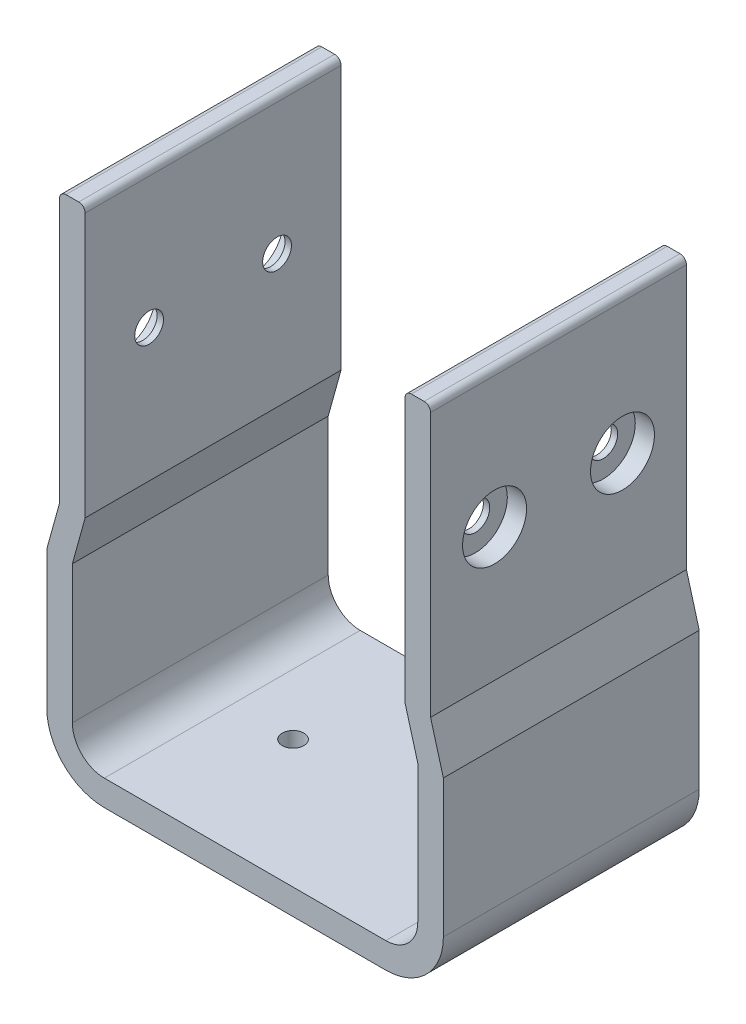
ISO-10303-21;
HEADER;
FILE_DESCRIPTION(('STEP AP214'),'2;1');
FILE_NAME('part.step','',(''),(''),'','','');
FILE_SCHEMA(('AUTOMOTIVE_DESIGN { 1 0 10303 214 1 1 1 1 }'));
ENDSEC;
DATA;
#1=APPLICATION_CONTEXT('core data for automotive mechanical design processes');
#2=APPLICATION_PROTOCOL_DEFINITION('international standard','automotive_design',2000,#1);
#3=PRODUCT_CONTEXT('',#1,'mechanical');
#4=PRODUCT('Part','Part','',(#3));
#5=PRODUCT_RELATED_PRODUCT_CATEGORY('part','',(#4));
#6=PRODUCT_DEFINITION_FORMATION('','',#4);
#7=PRODUCT_DEFINITION_CONTEXT('part definition',#1,'design');
#8=PRODUCT_DEFINITION('design','',#6,#7);
#9=PRODUCT_DEFINITION_SHAPE('','',#8);
#10=(LENGTH_UNIT() NAMED_UNIT(*) SI_UNIT(.MILLI.,.METRE.));
#11=(NAMED_UNIT(*) PLANE_ANGLE_UNIT() SI_UNIT($,.RADIAN.));
#12=(NAMED_UNIT(*) SI_UNIT($,.STERADIAN.) SOLID_ANGLE_UNIT());
#13=UNCERTAINTY_MEASURE_WITH_UNIT(LENGTH_MEASURE(1.E-05),#10,'distance_accuracy_value','');
#14=(GEOMETRIC_REPRESENTATION_CONTEXT(3) GLOBAL_UNCERTAINTY_ASSIGNED_CONTEXT((#13)) GLOBAL_UNIT_ASSIGNED_CONTEXT((#10,
#11,#12)) REPRESENTATION_CONTEXT('',''));
#15=CARTESIAN_POINT('',(0.,0.,0.));
#16=DIRECTION('',(0.,0.,1.));
#17=DIRECTION('',(1.,0.,0.));
#18=AXIS2_PLACEMENT_3D('',#15,#16,#17);
#19=CARTESIAN_POINT('',(62.,30.52,40.));
#20=DIRECTION('',(-0.963613585520307,-0.267299191545165,0.));
#21=DIRECTION('',(0.267299191545165,-0.963613585520307,0.));
#22=AXIS2_PLACEMENT_3D('',#19,#20,#21);
#23=PLANE('',#22);
#24=DIRECTION('',(-0.267299191545165,0.963613585520307,0.));
#25=VECTOR('',#24,1.);
#26=CARTESIAN_POINT('',(62.,30.52,0.));
#27=LINE('',#26,#25);
#28=CARTESIAN_POINT('',(62.,30.52,0.));
#29=VERTEX_POINT('',#28);
#30=CARTESIAN_POINT('',(60.,37.73,0.));
#31=VERTEX_POINT('',#30);
#32=EDGE_CURVE('E234',#29,#31,#27,.T.);
#33=ORIENTED_EDGE('',*,*,#32,.T.);
#34=DIRECTION('',(0.,0.,-1.));
#35=VECTOR('',#34,1.);
#36=CARTESIAN_POINT('',(60.,37.73,40.));
#37=LINE('',#36,#35);
#38=CARTESIAN_POINT('',(60.,37.73,40.));
#39=VERTEX_POINT('',#38);
#40=EDGE_CURVE('E214',#39,#31,#37,.T.);
#41=ORIENTED_EDGE('',*,*,#40,.F.);
#42=DIRECTION('',(-0.267299191545165,0.963613585520307,0.));
#43=VECTOR('',#42,1.);
#44=CARTESIAN_POINT('',(62.,30.52,40.));
#45=LINE('',#44,#43);
#46=CARTESIAN_POINT('',(62.,30.52,40.));
#47=VERTEX_POINT('',#46);
#48=EDGE_CURVE('E221',#47,#39,#45,.T.);
#49=ORIENTED_EDGE('',*,*,#48,.F.);
#50=DIRECTION('',(0.,0.,-1.));
#51=VECTOR('',#50,1.);
#52=CARTESIAN_POINT('',(62.,30.52,40.));
#53=LINE('',#52,#51);
#54=EDGE_CURVE('E407',#47,#29,#53,.T.);
#55=ORIENTED_EDGE('',*,*,#54,.T.);
#56=EDGE_LOOP('',(#33,#41,#49,#55));
#57=FACE_BOUND('',#56,.T.);
#58=ADVANCED_FACE('F43',(#57),#23,.F.);
#59=CARTESIAN_POINT('',(60.,37.73,40.));
#60=DIRECTION('',(-1.,0.,0.));
#61=DIRECTION('',(0.,-1.,0.));
#62=AXIS2_PLACEMENT_3D('',#59,#60,#61);
#63=PLANE('',#62);
#64=CARTESIAN_POINT('',(60.,58.5,30.));
#65=DIRECTION('',(1.,0.,0.));
#66=DIRECTION('',(0.,0.,-1.));
#67=AXIS2_PLACEMENT_3D('',#64,#65,#66);
#68=CIRCLE('',#67,4.99999999999999);
#69=CARTESIAN_POINT('',(60.,58.5,25.));
#70=VERTEX_POINT('',#69);
#71=EDGE_CURVE('E323',#70,#70,#68,.T.);
#72=ORIENTED_EDGE('',*,*,#71,.F.);
#73=EDGE_LOOP('',(#72));
#74=FACE_BOUND('',#73,.T.);
#75=CARTESIAN_POINT('',(60.,58.5,10.));
#76=DIRECTION('',(1.,0.,0.));
#77=DIRECTION('',(0.,0.,-1.));
#78=AXIS2_PLACEMENT_3D('',#75,#76,#77);
#79=CIRCLE('',#78,4.99999999999999);
#80=CARTESIAN_POINT('',(60.,58.5,5.00000000000001));
#81=VERTEX_POINT('',#80);
#82=EDGE_CURVE('E307',#81,#81,#79,.T.);
#83=ORIENTED_EDGE('',*,*,#82,.F.);
#84=EDGE_LOOP('',(#83));
#85=FACE_BOUND('',#84,.T.);
#86=DIRECTION('',(0.,1.,0.));
#87=VECTOR('',#86,1.);
#88=CARTESIAN_POINT('',(60.,37.73,0.));
#89=LINE('',#88,#87);
#90=CARTESIAN_POINT('',(60.,79.,0.));
#91=VERTEX_POINT('',#90);
#92=EDGE_CURVE('E410',#31,#91,#89,.T.);
#93=ORIENTED_EDGE('',*,*,#92,.T.);
#94=DIRECTION('',(0.,0.,-1.));
#95=VECTOR('',#94,1.);
#96=CARTESIAN_POINT('',(60.,79.,40.));
#97=LINE('',#96,#95);
#98=CARTESIAN_POINT('',(60.,79.,40.));
#99=VERTEX_POINT('',#98);
#100=EDGE_CURVE('E217',#91,#99,#97,.F.);
#101=ORIENTED_EDGE('',*,*,#100,.T.);
#102=DIRECTION('',(0.,1.,0.));
#103=VECTOR('',#102,1.);
#104=CARTESIAN_POINT('',(60.,37.73,40.));
#105=LINE('',#104,#103);
#106=EDGE_CURVE('E209',#39,#99,#105,.T.);
#107=ORIENTED_EDGE('',*,*,#106,.F.);
#108=ORIENTED_EDGE('',*,*,#40,.T.);
#109=EDGE_LOOP('',(#93,#101,#107,#108));
#110=FACE_BOUND('',#109,.T.);
#111=ADVANCED_FACE('F212',(#74,#85,#110),#63,.F.);
#112=CARTESIAN_POINT('',(60.,80.,40.));
#113=DIRECTION('',(0.,-1.,0.));
#114=DIRECTION('',(0.,0.,-1.));
#115=AXIS2_PLACEMENT_3D('',#112,#113,#114);
#116=PLANE('',#115);
#117=DIRECTION('',(-1.,0.,0.));
#118=VECTOR('',#117,1.);
#119=CARTESIAN_POINT('',(60.,80.,40.));
#120=LINE('',#119,#118);
#121=CARTESIAN_POINT('',(59.,80.,40.));
#122=VERTEX_POINT('',#121);
#123=CARTESIAN_POINT('',(57.,80.,40.));
#124=VERTEX_POINT('',#123);
#125=EDGE_CURVE('E220',#122,#124,#120,.T.);
#126=ORIENTED_EDGE('',*,*,#125,.F.);
#127=DIRECTION('',(0.,0.,-1.));
#128=VECTOR('',#127,1.);
#129=CARTESIAN_POINT('',(59.,80.,40.));
#130=LINE('',#129,#128);
#131=CARTESIAN_POINT('',(59.,80.,0.));
#132=VERTEX_POINT('',#131);
#133=EDGE_CURVE('E241',#122,#132,#130,.T.);
#134=ORIENTED_EDGE('',*,*,#133,.T.);
#135=DIRECTION('',(-1.,0.,0.));
#136=VECTOR('',#135,1.);
#137=CARTESIAN_POINT('',(60.,80.,0.));
#138=LINE('',#137,#136);
#139=CARTESIAN_POINT('',(57.,80.,0.));
#140=VERTEX_POINT('',#139);
#141=EDGE_CURVE('E413',#132,#140,#138,.T.);
#142=ORIENTED_EDGE('',*,*,#141,.T.);
#143=DIRECTION('',(0.,0.,-1.));
#144=VECTOR('',#143,1.);
#145=CARTESIAN_POINT('',(57.,80.,40.));
#146=LINE('',#145,#144);
#147=EDGE_CURVE('E236',#140,#124,#146,.F.);
#148=ORIENTED_EDGE('',*,*,#147,.T.);
#149=EDGE_LOOP('',(#126,#134,#142,#148));
#150=FACE_BOUND('',#149,.T.);
#151=ADVANCED_FACE('F555',(#150),#116,.F.);
#152=CARTESIAN_POINT('',(56.,80.,40.));
#153=DIRECTION('',(1.,0.,0.));
#154=DIRECTION('',(0.,0.,-1.));
#155=AXIS2_PLACEMENT_3D('',#152,#153,#154);
#156=PLANE('',#155);
#157=CARTESIAN_POINT('',(56.,58.5,30.));
#158=DIRECTION('',(1.,0.,0.));
#159=DIRECTION('',(0.,0.,-1.));
#160=AXIS2_PLACEMENT_3D('',#157,#158,#159);
#161=CIRCLE('',#160,2.25);
#162=CARTESIAN_POINT('',(56.,58.5,27.75));
#163=VERTEX_POINT('',#162);
#164=EDGE_CURVE('E304',#163,#163,#161,.T.);
#165=ORIENTED_EDGE('',*,*,#164,.T.);
#166=EDGE_LOOP('',(#165));
#167=FACE_BOUND('',#166,.T.);
#168=CARTESIAN_POINT('',(56.,58.5,10.));
#169=DIRECTION('',(1.,0.,0.));
#170=DIRECTION('',(0.,0.,-1.));
#171=AXIS2_PLACEMENT_3D('',#168,#169,#170);
#172=CIRCLE('',#171,2.25);
#173=CARTESIAN_POINT('',(56.,58.5,7.75));
#174=VERTEX_POINT('',#173);
#175=EDGE_CURVE('E299',#174,#174,#172,.T.);
#176=ORIENTED_EDGE('',*,*,#175,.T.);
#177=EDGE_LOOP('',(#176));
#178=FACE_BOUND('',#177,.T.);
#179=DIRECTION('',(0.,-1.,0.));
#180=VECTOR('',#179,1.);
#181=CARTESIAN_POINT('',(56.,80.,40.));
#182=LINE('',#181,#180);
#183=CARTESIAN_POINT('',(56.,79.,40.));
#184=VERTEX_POINT('',#183);
#185=CARTESIAN_POINT('',(56.,37.73,40.));
#186=VERTEX_POINT('',#185);
#187=EDGE_CURVE('E356',#184,#186,#182,.T.);
#188=ORIENTED_EDGE('',*,*,#187,.F.);
#189=DIRECTION('',(0.,0.,-1.));
#190=VECTOR('',#189,1.);
#191=CARTESIAN_POINT('',(56.,79.,40.));
#192=LINE('',#191,#190);
#193=CARTESIAN_POINT('',(56.,79.,0.));
#194=VERTEX_POINT('',#193);
#195=EDGE_CURVE('E276',#184,#194,#192,.T.);
#196=ORIENTED_EDGE('',*,*,#195,.T.);
#197=DIRECTION('',(0.,-1.,0.));
#198=VECTOR('',#197,1.);
#199=CARTESIAN_POINT('',(56.,80.,0.));
#200=LINE('',#199,#198);
#201=CARTESIAN_POINT('',(56.,37.73,0.));
#202=VERTEX_POINT('',#201);
#203=EDGE_CURVE('E417',#194,#202,#200,.T.);
#204=ORIENTED_EDGE('',*,*,#203,.T.);
#205=DIRECTION('',(0.,0.,-1.));
#206=VECTOR('',#205,1.);
#207=CARTESIAN_POINT('',(56.,37.73,40.));
#208=LINE('',#207,#206);
#209=EDGE_CURVE('E237',#186,#202,#208,.T.);
#210=ORIENTED_EDGE('',*,*,#209,.F.);
#211=EDGE_LOOP('',(#188,#196,#204,#210));
#212=FACE_BOUND('',#211,.T.);
#213=ADVANCED_FACE('F549',(#167,#178,#212),#156,.F.);
#214=CARTESIAN_POINT('',(56.,37.73,40.));
#215=DIRECTION('',(0.963613585520307,0.267299191545164,0.));
#216=DIRECTION('',(-0.267299191545164,0.963613585520307,0.));
#217=AXIS2_PLACEMENT_3D('',#214,#215,#216);
#218=PLANE('',#217);
#219=DIRECTION('',(0.267299191545164,-0.963613585520307,0.));
#220=VECTOR('',#219,1.);
#221=CARTESIAN_POINT('',(56.,37.73,0.));
#222=LINE('',#221,#220);
#223=CARTESIAN_POINT('',(58.,30.52,0.));
#224=VERTEX_POINT('',#223);
#225=EDGE_CURVE('E420',#202,#224,#222,.T.);
#226=ORIENTED_EDGE('',*,*,#225,.T.);
#227=DIRECTION('',(0.,0.,-1.));
#228=VECTOR('',#227,1.);
#229=CARTESIAN_POINT('',(58.,30.52,40.));
#230=LINE('',#229,#228);
#231=CARTESIAN_POINT('',(58.,30.52,40.));
#232=VERTEX_POINT('',#231);
#233=EDGE_CURVE('E244',#232,#224,#230,.T.);
#234=ORIENTED_EDGE('',*,*,#233,.F.);
#235=DIRECTION('',(0.267299191545164,-0.963613585520307,0.));
#236=VECTOR('',#235,1.);
#237=CARTESIAN_POINT('',(56.,37.73,40.));
#238=LINE('',#237,#236);
#239=EDGE_CURVE('E359',#186,#232,#238,.T.);
#240=ORIENTED_EDGE('',*,*,#239,.F.);
#241=ORIENTED_EDGE('',*,*,#209,.T.);
#242=EDGE_LOOP('',(#226,#234,#240,#241));
#243=FACE_BOUND('',#242,.T.);
#244=ADVANCED_FACE('F547',(#243),#218,.F.);
#245=CARTESIAN_POINT('',(58.,30.52,40.));
#246=DIRECTION('',(1.,0.,0.));
#247=DIRECTION('',(0.,1.,0.));
#248=AXIS2_PLACEMENT_3D('',#245,#246,#247);
#249=PLANE('',#248);
#250=DIRECTION('',(0.,-1.,0.));
#251=VECTOR('',#250,1.);
#252=CARTESIAN_POINT('',(58.,30.52,0.));
#253=LINE('',#252,#251);
#254=CARTESIAN_POINT('',(58.,9.,0.));
#255=VERTEX_POINT('',#254);
#256=EDGE_CURVE('E423',#224,#255,#253,.T.);
#257=ORIENTED_EDGE('',*,*,#256,.T.);
#258=DIRECTION('',(0.,0.,-1.));
#259=VECTOR('',#258,1.);
#260=CARTESIAN_POINT('',(58.,9.,40.));
#261=LINE('',#260,#259);
#262=CARTESIAN_POINT('',(58.,9.,40.));
#263=VERTEX_POINT('',#262);
#264=EDGE_CURVE('E514',#263,#255,#261,.T.);
#265=ORIENTED_EDGE('',*,*,#264,.F.);
#266=DIRECTION('',(0.,-1.,0.));
#267=VECTOR('',#266,1.);
#268=CARTESIAN_POINT('',(58.,30.52,40.));
#269=LINE('',#268,#267);
#270=EDGE_CURVE('E362',#232,#263,#269,.T.);
#271=ORIENTED_EDGE('',*,*,#270,.F.);
#272=ORIENTED_EDGE('',*,*,#233,.T.);
#273=EDGE_LOOP('',(#257,#265,#271,#272));
#274=FACE_BOUND('',#273,.T.);
#275=ADVANCED_FACE('F523',(#274),#249,.F.);
#276=CARTESIAN_POINT('',(53.,9.,40.));
#277=DIRECTION('',(0.,0.,-1.));
#278=DIRECTION('',(-1.,0.,0.));
#279=AXIS2_PLACEMENT_3D('',#276,#277,#278);
#280=CYLINDRICAL_SURFACE('',#279,5.);
#281=CARTESIAN_POINT('',(53.,9.,0.));
#282=DIRECTION('',(0.,0.,-1.));
#283=DIRECTION('',(1.,0.,0.));
#284=AXIS2_PLACEMENT_3D('',#281,#282,#283);
#285=CIRCLE('',#284,5.);
#286=CARTESIAN_POINT('',(53.,4.,0.));
#287=VERTEX_POINT('',#286);
#288=EDGE_CURVE('E426',#255,#287,#285,.T.);
#289=ORIENTED_EDGE('',*,*,#288,.T.);
#290=DIRECTION('',(0.,0.,-1.));
#291=VECTOR('',#290,1.);
#292=CARTESIAN_POINT('',(53.,4.,40.));
#293=LINE('',#292,#291);
#294=CARTESIAN_POINT('',(53.,4.,40.));
#295=VERTEX_POINT('',#294);
#296=EDGE_CURVE('E510',#295,#287,#293,.T.);
#297=ORIENTED_EDGE('',*,*,#296,.F.);
#298=CARTESIAN_POINT('',(53.,9.,40.));
#299=DIRECTION('',(0.,0.,-1.));
#300=DIRECTION('',(1.,0.,0.));
#301=AXIS2_PLACEMENT_3D('',#298,#299,#300);
#302=CIRCLE('',#301,5.);
#303=EDGE_CURVE('E365',#263,#295,#302,.T.);
#304=ORIENTED_EDGE('',*,*,#303,.F.);
#305=ORIENTED_EDGE('',*,*,#264,.T.);
#306=EDGE_LOOP('',(#289,#297,#304,#305));
#307=FACE_BOUND('',#306,.T.);
#308=ADVANCED_FACE('F537',(#307),#280,.F.);
#309=CARTESIAN_POINT('',(53.,4.,40.));
#310=DIRECTION('',(0.,-1.,0.));
#311=DIRECTION('',(1.,0.,0.));
#312=AXIS2_PLACEMENT_3D('',#309,#310,#311);
#313=PLANE('',#312);
#314=CARTESIAN_POINT('',(18.5,4.,20.));
#315=DIRECTION('',(0.,1.,0.));
#316=DIRECTION('',(0.,0.,1.));
#317=AXIS2_PLACEMENT_3D('',#314,#315,#316);
#318=CIRCLE('',#317,1.69999999999999);
#319=CARTESIAN_POINT('',(18.5,4.,21.7));
#320=VERTEX_POINT('',#319);
#321=EDGE_CURVE('E1051',#320,#320,#318,.T.);
#322=ORIENTED_EDGE('',*,*,#321,.F.);
#323=EDGE_LOOP('',(#322));
#324=FACE_BOUND('',#323,.T.);
#325=CARTESIAN_POINT('',(43.5,4.,20.));
#326=DIRECTION('',(0.,1.,0.));
#327=DIRECTION('',(0.,0.,1.));
#328=AXIS2_PLACEMENT_3D('',#325,#326,#327);
#329=CIRCLE('',#328,1.69999999999999);
#330=CARTESIAN_POINT('',(43.5,4.,21.7));
#331=VERTEX_POINT('',#330);
#332=EDGE_CURVE('E1055',#331,#331,#329,.T.);
#333=ORIENTED_EDGE('',*,*,#332,.F.);
#334=EDGE_LOOP('',(#333));
#335=FACE_BOUND('',#334,.T.);
#336=DIRECTION('',(-1.,0.,0.));
#337=VECTOR('',#336,1.);
#338=CARTESIAN_POINT('',(53.,4.,0.));
#339=LINE('',#338,#337);
#340=CARTESIAN_POINT('',(9.00000000000004,3.99999999999999,0.));
#341=VERTEX_POINT('',#340);
#342=EDGE_CURVE('E429',#287,#341,#339,.T.);
#343=ORIENTED_EDGE('',*,*,#342,.T.);
#344=DIRECTION('',(0.,0.,-1.));
#345=VECTOR('',#344,1.);
#346=CARTESIAN_POINT('',(9.00000000000004,3.99999999999999,40.));
#347=LINE('',#346,#345);
#348=CARTESIAN_POINT('',(9.00000000000004,3.99999999999999,40.));
#349=VERTEX_POINT('',#348);
#350=EDGE_CURVE('E506',#349,#341,#347,.T.);
#351=ORIENTED_EDGE('',*,*,#350,.F.);
#352=DIRECTION('',(-1.,0.,0.));
#353=VECTOR('',#352,1.);
#354=CARTESIAN_POINT('',(53.,4.,40.));
#355=LINE('',#354,#353);
#356=EDGE_CURVE('E368',#295,#349,#355,.T.);
#357=ORIENTED_EDGE('',*,*,#356,.F.);
#358=ORIENTED_EDGE('',*,*,#296,.T.);
#359=EDGE_LOOP('',(#343,#351,#357,#358));
#360=FACE_BOUND('',#359,.T.);
#361=ADVANCED_FACE('F541',(#324,#335,#360),#313,.F.);
#362=CARTESIAN_POINT('',(9.,8.99999999999999,40.));
#363=DIRECTION('',(0.,0.,-1.));
#364=DIRECTION('',(-1.,0.,0.));
#365=AXIS2_PLACEMENT_3D('',#362,#363,#364);
#366=CYLINDRICAL_SURFACE('',#365,5.);
#367=CARTESIAN_POINT('',(9.,8.99999999999999,0.));
#368=DIRECTION('',(0.,0.,-1.));
#369=DIRECTION('',(-1.,0.,0.));
#370=AXIS2_PLACEMENT_3D('',#367,#368,#369);
#371=CIRCLE('',#370,5.);
#372=CARTESIAN_POINT('',(4.,9.00000000000003,0.));
#373=VERTEX_POINT('',#372);
#374=EDGE_CURVE('E432',#341,#373,#371,.T.);
#375=ORIENTED_EDGE('',*,*,#374,.T.);
#376=DIRECTION('',(0.,0.,-1.));
#377=VECTOR('',#376,1.);
#378=CARTESIAN_POINT('',(4.,9.00000000000003,40.));
#379=LINE('',#378,#377);
#380=CARTESIAN_POINT('',(4.,9.00000000000003,40.));
#381=VERTEX_POINT('',#380);
#382=EDGE_CURVE('E502',#381,#373,#379,.T.);
#383=ORIENTED_EDGE('',*,*,#382,.F.);
#384=CARTESIAN_POINT('',(9.,8.99999999999999,40.));
#385=DIRECTION('',(0.,0.,-1.));
#386=DIRECTION('',(-1.,0.,0.));
#387=AXIS2_PLACEMENT_3D('',#384,#385,#386);
#388=CIRCLE('',#387,5.);
#389=EDGE_CURVE('E371',#349,#381,#388,.T.);
#390=ORIENTED_EDGE('',*,*,#389,.F.);
#391=ORIENTED_EDGE('',*,*,#350,.T.);
#392=EDGE_LOOP('',(#375,#383,#390,#391));
#393=FACE_BOUND('',#392,.T.);
#394=ADVANCED_FACE('F822',(#393),#366,.F.);
#395=CARTESIAN_POINT('',(4.,9.00000000000003,40.));
#396=DIRECTION('',(-1.,0.,0.));
#397=DIRECTION('',(0.,-1.,0.));
#398=AXIS2_PLACEMENT_3D('',#395,#396,#397);
#399=PLANE('',#398);
#400=DIRECTION('',(0.,1.,0.));
#401=VECTOR('',#400,1.);
#402=CARTESIAN_POINT('',(4.,9.00000000000003,0.));
#403=LINE('',#402,#401);
#404=CARTESIAN_POINT('',(4.,30.52,0.));
#405=VERTEX_POINT('',#404);
#406=EDGE_CURVE('E435',#373,#405,#403,.T.);
#407=ORIENTED_EDGE('',*,*,#406,.T.);
#408=DIRECTION('',(0.,0.,-1.));
#409=VECTOR('',#408,1.);
#410=CARTESIAN_POINT('',(4.,30.52,40.));
#411=LINE('',#410,#409);
#412=CARTESIAN_POINT('',(4.,30.52,40.));
#413=VERTEX_POINT('',#412);
#414=EDGE_CURVE('E498',#413,#405,#411,.T.);
#415=ORIENTED_EDGE('',*,*,#414,.F.);
#416=DIRECTION('',(0.,1.,0.));
#417=VECTOR('',#416,1.);
#418=CARTESIAN_POINT('',(4.,9.00000000000003,40.));
#419=LINE('',#418,#417);
#420=EDGE_CURVE('E374',#381,#413,#419,.T.);
#421=ORIENTED_EDGE('',*,*,#420,.F.);
#422=ORIENTED_EDGE('',*,*,#382,.T.);
#423=EDGE_LOOP('',(#407,#415,#421,#422));
#424=FACE_BOUND('',#423,.T.);
#425=ADVANCED_FACE('F951',(#424),#399,.F.);
#426=CARTESIAN_POINT('',(4.,30.52,40.));
#427=DIRECTION('',(-0.963613585520308,0.267299191545161,0.));
#428=DIRECTION('',(-0.267299191545161,-0.963613585520308,0.));
#429=AXIS2_PLACEMENT_3D('',#426,#427,#428);
#430=PLANE('',#429);
#431=DIRECTION('',(0.267299191545161,0.963613585520308,0.));
#432=VECTOR('',#431,1.);
#433=CARTESIAN_POINT('',(4.,30.52,0.));
#434=LINE('',#433,#432);
#435=CARTESIAN_POINT('',(5.99999999999999,37.73,0.));
#436=VERTEX_POINT('',#435);
#437=EDGE_CURVE('E438',#405,#436,#434,.T.);
#438=ORIENTED_EDGE('',*,*,#437,.T.);
#439=DIRECTION('',(0.,0.,-1.));
#440=VECTOR('',#439,1.);
#441=CARTESIAN_POINT('',(5.99999999999999,37.73,40.));
#442=LINE('',#441,#440);
#443=CARTESIAN_POINT('',(5.99999999999999,37.73,40.));
#444=VERTEX_POINT('',#443);
#445=EDGE_CURVE('E494',#444,#436,#442,.T.);
#446=ORIENTED_EDGE('',*,*,#445,.F.);
#447=DIRECTION('',(0.267299191545161,0.963613585520308,0.));
#448=VECTOR('',#447,1.);
#449=CARTESIAN_POINT('',(4.,30.52,40.));
#450=LINE('',#449,#448);
#451=EDGE_CURVE('E377',#413,#444,#450,.T.);
#452=ORIENTED_EDGE('',*,*,#451,.F.);
#453=ORIENTED_EDGE('',*,*,#414,.T.);
#454=EDGE_LOOP('',(#438,#446,#452,#453));
#455=FACE_BOUND('',#454,.T.);
#456=ADVANCED_FACE('F646',(#455),#430,.F.);
#457=CARTESIAN_POINT('',(5.99999999999999,37.73,40.));
#458=DIRECTION('',(-1.,0.,0.));
#459=DIRECTION('',(0.,0.,1.));
#460=AXIS2_PLACEMENT_3D('',#457,#458,#459);
#461=PLANE('',#460);
#462=CARTESIAN_POINT('',(5.99999999999999,58.5,10.));
#463=DIRECTION('',(-1.,0.,0.));
#464=DIRECTION('',(0.,0.,1.));
#465=AXIS2_PLACEMENT_3D('',#462,#463,#464);
#466=CIRCLE('',#465,2.25);
#467=CARTESIAN_POINT('',(5.99999999999999,58.5,12.25));
#468=VERTEX_POINT('',#467);
#469=EDGE_CURVE('E293',#468,#468,#466,.T.);
#470=ORIENTED_EDGE('',*,*,#469,.T.);
#471=EDGE_LOOP('',(#470));
#472=FACE_BOUND('',#471,.T.);
#473=CARTESIAN_POINT('',(5.99999999999999,58.5,30.));
#474=DIRECTION('',(-1.,0.,0.));
#475=DIRECTION('',(0.,0.,1.));
#476=AXIS2_PLACEMENT_3D('',#473,#474,#475);
#477=CIRCLE('',#476,2.25);
#478=CARTESIAN_POINT('',(5.99999999999999,58.5,32.25));
#479=VERTEX_POINT('',#478);
#480=EDGE_CURVE('E288',#479,#479,#477,.T.);
#481=ORIENTED_EDGE('',*,*,#480,.T.);
#482=EDGE_LOOP('',(#481));
#483=FACE_BOUND('',#482,.T.);
#484=DIRECTION('',(0.,1.,0.));
#485=VECTOR('',#484,1.);
#486=CARTESIAN_POINT('',(5.99999999999999,37.73,0.));
#487=LINE('',#486,#485);
#488=CARTESIAN_POINT('',(5.99999999999999,79.,0.));
#489=VERTEX_POINT('',#488);
#490=EDGE_CURVE('E441',#436,#489,#487,.T.);
#491=ORIENTED_EDGE('',*,*,#490,.T.);
#492=DIRECTION('',(0.,0.,-1.));
#493=VECTOR('',#492,1.);
#494=CARTESIAN_POINT('',(5.99999999999999,79.,40.));
#495=LINE('',#494,#493);
#496=CARTESIAN_POINT('',(5.99999999999999,79.,40.));
#497=VERTEX_POINT('',#496);
#498=EDGE_CURVE('E53',#489,#497,#495,.F.);
#499=ORIENTED_EDGE('',*,*,#498,.T.);
#500=DIRECTION('',(0.,1.,0.));
#501=VECTOR('',#500,1.);
#502=CARTESIAN_POINT('',(5.99999999999999,37.73,40.));
#503=LINE('',#502,#501);
#504=EDGE_CURVE('E380',#444,#497,#503,.T.);
#505=ORIENTED_EDGE('',*,*,#504,.F.);
#506=ORIENTED_EDGE('',*,*,#445,.T.);
#507=EDGE_LOOP('',(#491,#499,#505,#506));
#508=FACE_BOUND('',#507,.T.);
#509=ADVANCED_FACE('F640',(#472,#483,#508),#461,.F.);
#510=CARTESIAN_POINT('',(5.99999999999999,80.,40.));
#511=DIRECTION('',(0.,-1.,0.));
#512=DIRECTION('',(0.,0.,-1.));
#513=AXIS2_PLACEMENT_3D('',#510,#511,#512);
#514=PLANE('',#513);
#515=DIRECTION('',(-1.,0.,0.));
#516=VECTOR('',#515,1.);
#517=CARTESIAN_POINT('',(5.99999999999999,80.,40.));
#518=LINE('',#517,#516);
#519=CARTESIAN_POINT('',(4.99999999999999,80.,40.));
#520=VERTEX_POINT('',#519);
#521=CARTESIAN_POINT('',(2.99999999999999,80.,40.));
#522=VERTEX_POINT('',#521);
#523=EDGE_CURVE('E384',#520,#522,#518,.T.);
#524=ORIENTED_EDGE('',*,*,#523,.F.);
#525=DIRECTION('',(0.,0.,-1.));
#526=VECTOR('',#525,1.);
#527=CARTESIAN_POINT('',(4.99999999999999,80.,40.));
#528=LINE('',#527,#526);
#529=CARTESIAN_POINT('',(4.99999999999999,80.,0.));
#530=VERTEX_POINT('',#529);
#531=EDGE_CURVE('E282',#520,#530,#528,.T.);
#532=ORIENTED_EDGE('',*,*,#531,.T.);
#533=DIRECTION('',(-1.,0.,0.));
#534=VECTOR('',#533,1.);
#535=CARTESIAN_POINT('',(5.99999999999999,80.,0.));
#536=LINE('',#535,#534);
#537=CARTESIAN_POINT('',(2.99999999999999,80.,0.));
#538=VERTEX_POINT('',#537);
#539=EDGE_CURVE('E445',#530,#538,#536,.T.);
#540=ORIENTED_EDGE('',*,*,#539,.T.);
#541=DIRECTION('',(0.,0.,-1.));
#542=VECTOR('',#541,1.);
#543=CARTESIAN_POINT('',(2.99999999999999,80.,40.));
#544=LINE('',#543,#542);
#545=EDGE_CURVE('E69',#538,#522,#544,.F.);
#546=ORIENTED_EDGE('',*,*,#545,.T.);
#547=EDGE_LOOP('',(#524,#532,#540,#546));
#548=FACE_BOUND('',#547,.T.);
#549=ADVANCED_FACE('F645',(#548),#514,.F.);
#550=CARTESIAN_POINT('',(1.99999999999999,80.,40.));
#551=DIRECTION('',(1.,0.,0.));
#552=DIRECTION('',(0.,1.,0.));
#553=AXIS2_PLACEMENT_3D('',#550,#551,#552);
#554=PLANE('',#553);
#555=CARTESIAN_POINT('',(2.,58.5,10.));
#556=DIRECTION('',(-1.,0.,0.));
#557=DIRECTION('',(0.,0.,1.));
#558=AXIS2_PLACEMENT_3D('',#555,#556,#557);
#559=CIRCLE('',#558,5.);
#560=CARTESIAN_POINT('',(2.,58.5,15.));
#561=VERTEX_POINT('',#560);
#562=EDGE_CURVE('E302',#561,#561,#559,.T.);
#563=ORIENTED_EDGE('',*,*,#562,.F.);
#564=EDGE_LOOP('',(#563));
#565=FACE_BOUND('',#564,.T.);
#566=CARTESIAN_POINT('',(2.,58.5,30.));
#567=DIRECTION('',(-1.,0.,0.));
#568=DIRECTION('',(0.,0.,1.));
#569=AXIS2_PLACEMENT_3D('',#566,#567,#568);
#570=CIRCLE('',#569,5.);
#571=CARTESIAN_POINT('',(2.,58.5,35.));
#572=VERTEX_POINT('',#571);
#573=EDGE_CURVE('E297',#572,#572,#570,.T.);
#574=ORIENTED_EDGE('',*,*,#573,.F.);
#575=EDGE_LOOP('',(#574));
#576=FACE_BOUND('',#575,.T.);
#577=DIRECTION('',(0.,-1.,0.));
#578=VECTOR('',#577,1.);
#579=CARTESIAN_POINT('',(1.99999999999999,80.,40.));
#580=LINE('',#579,#578);
#581=CARTESIAN_POINT('',(1.99999999999999,79.,40.));
#582=VERTEX_POINT('',#581);
#583=CARTESIAN_POINT('',(2.,37.73,40.));
#584=VERTEX_POINT('',#583);
#585=EDGE_CURVE('E387',#582,#584,#580,.T.);
#586=ORIENTED_EDGE('',*,*,#585,.F.);
#587=DIRECTION('',(0.,0.,-1.));
#588=VECTOR('',#587,1.);
#589=CARTESIAN_POINT('',(1.99999999999999,79.,40.));
#590=LINE('',#589,#588);
#591=CARTESIAN_POINT('',(1.99999999999999,79.,0.));
#592=VERTEX_POINT('',#591);
#593=EDGE_CURVE('E11',#582,#592,#590,.T.);
#594=ORIENTED_EDGE('',*,*,#593,.T.);
#595=DIRECTION('',(0.,-1.,0.));
#596=VECTOR('',#595,1.);
#597=CARTESIAN_POINT('',(1.99999999999999,80.,0.));
#598=LINE('',#597,#596);
#599=CARTESIAN_POINT('',(2.,37.73,0.));
#600=VERTEX_POINT('',#599);
#601=EDGE_CURVE('E448',#592,#600,#598,.T.);
#602=ORIENTED_EDGE('',*,*,#601,.T.);
#603=DIRECTION('',(0.,0.,-1.));
#604=VECTOR('',#603,1.);
#605=CARTESIAN_POINT('',(2.,37.73,40.));
#606=LINE('',#605,#604);
#607=EDGE_CURVE('E490',#584,#600,#606,.T.);
#608=ORIENTED_EDGE('',*,*,#607,.F.);
#609=EDGE_LOOP('',(#586,#594,#602,#608));
#610=FACE_BOUND('',#609,.T.);
#611=ADVANCED_FACE('F593',(#565,#576,#610),#554,.F.);
#612=CARTESIAN_POINT('',(2.,37.73,40.));
#613=DIRECTION('',(0.963613585520308,-0.267299191545161,0.));
#614=DIRECTION('',(0.267299191545161,0.963613585520308,0.));
#615=AXIS2_PLACEMENT_3D('',#612,#613,#614);
#616=PLANE('',#615);
#617=DIRECTION('',(-0.267299191545161,-0.963613585520308,0.));
#618=VECTOR('',#617,1.);
#619=CARTESIAN_POINT('',(2.,37.73,0.));
#620=LINE('',#619,#618);
#621=CARTESIAN_POINT('',(0.,30.52,0.));
#622=VERTEX_POINT('',#621);
#623=EDGE_CURVE('E451',#600,#622,#620,.T.);
#624=ORIENTED_EDGE('',*,*,#623,.T.);
#625=DIRECTION('',(0.,0.,-1.));
#626=VECTOR('',#625,1.);
#627=CARTESIAN_POINT('',(0.,30.52,40.));
#628=LINE('',#627,#626);
#629=CARTESIAN_POINT('',(0.,30.52,40.));
#630=VERTEX_POINT('',#629);
#631=EDGE_CURVE('E486',#630,#622,#628,.T.);
#632=ORIENTED_EDGE('',*,*,#631,.F.);
#633=DIRECTION('',(-0.267299191545161,-0.963613585520308,0.));
#634=VECTOR('',#633,1.);
#635=CARTESIAN_POINT('',(2.,37.73,40.));
#636=LINE('',#635,#634);
#637=EDGE_CURVE('E390',#584,#630,#636,.T.);
#638=ORIENTED_EDGE('',*,*,#637,.F.);
#639=ORIENTED_EDGE('',*,*,#607,.T.);
#640=EDGE_LOOP('',(#624,#632,#638,#639));
#641=FACE_BOUND('',#640,.T.);
#642=ADVANCED_FACE('F588',(#641),#616,.F.);
#643=CARTESIAN_POINT('',(0.,30.52,40.));
#644=DIRECTION('',(1.,0.,0.));
#645=DIRECTION('',(0.,1.,0.));
#646=AXIS2_PLACEMENT_3D('',#643,#644,#645);
#647=PLANE('',#646);
#648=DIRECTION('',(0.,-1.,0.));
#649=VECTOR('',#648,1.);
#650=CARTESIAN_POINT('',(0.,30.52,0.));
#651=LINE('',#650,#649);
#652=CARTESIAN_POINT('',(0.,9.,0.));
#653=VERTEX_POINT('',#652);
#654=EDGE_CURVE('E454',#622,#653,#651,.T.);
#655=ORIENTED_EDGE('',*,*,#654,.T.);
#656=DIRECTION('',(0.,0.,-1.));
#657=VECTOR('',#656,1.);
#658=CARTESIAN_POINT('',(0.,9.,40.));
#659=LINE('',#658,#657);
#660=CARTESIAN_POINT('',(0.,9.,40.));
#661=VERTEX_POINT('',#660);
#662=EDGE_CURVE('E482',#661,#653,#659,.T.);
#663=ORIENTED_EDGE('',*,*,#662,.F.);
#664=DIRECTION('',(0.,-1.,0.));
#665=VECTOR('',#664,1.);
#666=CARTESIAN_POINT('',(0.,30.52,40.));
#667=LINE('',#666,#665);
#668=EDGE_CURVE('E393',#630,#661,#667,.T.);
#669=ORIENTED_EDGE('',*,*,#668,.F.);
#670=ORIENTED_EDGE('',*,*,#631,.T.);
#671=EDGE_LOOP('',(#655,#663,#669,#670));
#672=FACE_BOUND('',#671,.T.);
#673=ADVANCED_FACE('F584',(#672),#647,.F.);
#674=CARTESIAN_POINT('',(9.,9.,40.));
#675=DIRECTION('',(0.,0.,-1.));
#676=DIRECTION('',(-1.,0.,0.));
#677=AXIS2_PLACEMENT_3D('',#674,#675,#676);
#678=CYLINDRICAL_SURFACE('',#677,9.);
#679=CARTESIAN_POINT('',(9.,9.,0.));
#680=DIRECTION('',(0.,0.,1.));
#681=DIRECTION('',(-1.,0.,0.));
#682=AXIS2_PLACEMENT_3D('',#679,#680,#681);
#683=CIRCLE('',#682,9.);
#684=CARTESIAN_POINT('',(9.00000000000006,0.,0.));
#685=VERTEX_POINT('',#684);
#686=EDGE_CURVE('E457',#653,#685,#683,.T.);
#687=ORIENTED_EDGE('',*,*,#686,.T.);
#688=DIRECTION('',(0.,0.,-1.));
#689=VECTOR('',#688,1.);
#690=CARTESIAN_POINT('',(9.00000000000006,0.,40.));
#691=LINE('',#690,#689);
#692=CARTESIAN_POINT('',(9.00000000000006,0.,40.));
#693=VERTEX_POINT('',#692);
#694=EDGE_CURVE('E478',#693,#685,#691,.T.);
#695=ORIENTED_EDGE('',*,*,#694,.F.);
#696=CARTESIAN_POINT('',(9.,9.,40.));
#697=DIRECTION('',(0.,0.,1.));
#698=DIRECTION('',(-1.,0.,0.));
#699=AXIS2_PLACEMENT_3D('',#696,#697,#698);
#700=CIRCLE('',#699,9.);
#701=EDGE_CURVE('E396',#661,#693,#700,.T.);
#702=ORIENTED_EDGE('',*,*,#701,.F.);
#703=ORIENTED_EDGE('',*,*,#662,.T.);
#704=EDGE_LOOP('',(#687,#695,#702,#703));
#705=FACE_BOUND('',#704,.T.);
#706=ADVANCED_FACE('F579',(#705),#678,.T.);
#707=CARTESIAN_POINT('',(9.00000000000006,0.,40.));
#708=DIRECTION('',(0.,1.,0.));
#709=DIRECTION('',(0.,0.,1.));
#710=AXIS2_PLACEMENT_3D('',#707,#708,#709);
#711=PLANE('',#710);
#712=CARTESIAN_POINT('',(18.5,0.,20.));
#713=DIRECTION('',(0.,1.,0.));
#714=DIRECTION('',(0.,0.,1.));
#715=AXIS2_PLACEMENT_3D('',#712,#713,#714);
#716=CIRCLE('',#715,1.69999999999999);
#717=CARTESIAN_POINT('',(18.5,0.,21.7));
#718=VERTEX_POINT('',#717);
#719=EDGE_CURVE('E47',#718,#718,#716,.T.);
#720=ORIENTED_EDGE('',*,*,#719,.T.);
#721=EDGE_LOOP('',(#720));
#722=FACE_BOUND('',#721,.T.);
#723=CARTESIAN_POINT('',(43.5,0.,20.));
#724=DIRECTION('',(0.,1.,0.));
#725=DIRECTION('',(0.,0.,1.));
#726=AXIS2_PLACEMENT_3D('',#723,#724,#725);
#727=CIRCLE('',#726,1.69999999999999);
#728=CARTESIAN_POINT('',(43.5,0.,21.7));
#729=VERTEX_POINT('',#728);
#730=EDGE_CURVE('E1059',#729,#729,#727,.T.);
#731=ORIENTED_EDGE('',*,*,#730,.T.);
#732=EDGE_LOOP('',(#731));
#733=FACE_BOUND('',#732,.T.);
#734=DIRECTION('',(1.,0.,0.));
#735=VECTOR('',#734,1.);
#736=CARTESIAN_POINT('',(9.00000000000006,0.,0.));
#737=LINE('',#736,#735);
#738=CARTESIAN_POINT('',(52.9999999999999,0.,0.));
#739=VERTEX_POINT('',#738);
#740=EDGE_CURVE('E460',#685,#739,#737,.T.);
#741=ORIENTED_EDGE('',*,*,#740,.T.);
#742=DIRECTION('',(0.,0.,-1.));
#743=VECTOR('',#742,1.);
#744=CARTESIAN_POINT('',(52.9999999999999,0.,40.));
#745=LINE('',#744,#743);
#746=CARTESIAN_POINT('',(52.9999999999999,0.,40.));
#747=VERTEX_POINT('',#746);
#748=EDGE_CURVE('E474',#747,#739,#745,.T.);
#749=ORIENTED_EDGE('',*,*,#748,.F.);
#750=DIRECTION('',(1.,0.,0.));
#751=VECTOR('',#750,1.);
#752=CARTESIAN_POINT('',(9.00000000000006,0.,40.));
#753=LINE('',#752,#751);
#754=EDGE_CURVE('E399',#693,#747,#753,.T.);
#755=ORIENTED_EDGE('',*,*,#754,.F.);
#756=ORIENTED_EDGE('',*,*,#694,.T.);
#757=EDGE_LOOP('',(#741,#749,#755,#756));
#758=FACE_BOUND('',#757,.T.);
#759=ADVANCED_FACE('F573',(#722,#733,#758),#711,.F.);
#760=CARTESIAN_POINT('',(53.,9.,40.));
#761=DIRECTION('',(0.,0.,-1.));
#762=DIRECTION('',(-1.,0.,0.));
#763=AXIS2_PLACEMENT_3D('',#760,#761,#762);
#764=CYLINDRICAL_SURFACE('',#763,9.);
#765=CARTESIAN_POINT('',(53.,9.,0.));
#766=DIRECTION('',(0.,0.,1.));
#767=DIRECTION('',(1.,0.,0.));
#768=AXIS2_PLACEMENT_3D('',#765,#766,#767);
#769=CIRCLE('',#768,9.);
#770=CARTESIAN_POINT('',(62.,9.00000000000006,0.));
#771=VERTEX_POINT('',#770);
#772=EDGE_CURVE('E463',#739,#771,#769,.T.);
#773=ORIENTED_EDGE('',*,*,#772,.T.);
#774=DIRECTION('',(0.,0.,-1.));
#775=VECTOR('',#774,1.);
#776=CARTESIAN_POINT('',(62.,9.00000000000006,40.));
#777=LINE('',#776,#775);
#778=CARTESIAN_POINT('',(62.,9.00000000000006,40.));
#779=VERTEX_POINT('',#778);
#780=EDGE_CURVE('E470',#779,#771,#777,.T.);
#781=ORIENTED_EDGE('',*,*,#780,.F.);
#782=CARTESIAN_POINT('',(53.,9.,40.));
#783=DIRECTION('',(0.,0.,1.));
#784=DIRECTION('',(1.,0.,0.));
#785=AXIS2_PLACEMENT_3D('',#782,#783,#784);
#786=CIRCLE('',#785,9.);
#787=EDGE_CURVE('E402',#747,#779,#786,.T.);
#788=ORIENTED_EDGE('',*,*,#787,.F.);
#789=ORIENTED_EDGE('',*,*,#748,.T.);
#790=EDGE_LOOP('',(#773,#781,#788,#789));
#791=FACE_BOUND('',#790,.T.);
#792=ADVANCED_FACE('F569',(#791),#764,.T.);
#793=CARTESIAN_POINT('',(62.,9.00000000000006,40.));
#794=DIRECTION('',(-1.,0.,0.));
#795=DIRECTION('',(0.,0.,1.));
#796=AXIS2_PLACEMENT_3D('',#793,#794,#795);
#797=PLANE('',#796);
#798=DIRECTION('',(0.,1.,0.));
#799=VECTOR('',#798,1.);
#800=CARTESIAN_POINT('',(62.,9.00000000000006,0.));
#801=LINE('',#800,#799);
#802=EDGE_CURVE('E231',#771,#29,#801,.T.);
#803=ORIENTED_EDGE('',*,*,#802,.T.);
#804=ORIENTED_EDGE('',*,*,#54,.F.);
#805=DIRECTION('',(0.,1.,0.));
#806=VECTOR('',#805,1.);
#807=CARTESIAN_POINT('',(62.,9.00000000000006,40.));
#808=LINE('',#807,#806);
#809=EDGE_CURVE('E226',#779,#47,#808,.T.);
#810=ORIENTED_EDGE('',*,*,#809,.F.);
#811=ORIENTED_EDGE('',*,*,#780,.T.);
#812=EDGE_LOOP('',(#803,#804,#810,#811));
#813=FACE_BOUND('',#812,.T.);
#814=ADVANCED_FACE('F565',(#813),#797,.F.);
#815=CARTESIAN_POINT('',(53.,9.,40.));
#816=DIRECTION('',(0.,0.,1.));
#817=DIRECTION('',(1.,0.,0.));
#818=AXIS2_PLACEMENT_3D('',#815,#816,#817);
#819=PLANE('',#818);
#820=ORIENTED_EDGE('',*,*,#106,.T.);
#821=CARTESIAN_POINT('',(59.,79.,40.));
#822=DIRECTION('',(0.,0.,1.));
#823=DIRECTION('',(1.,0.,0.));
#824=AXIS2_PLACEMENT_3D('',#821,#822,#823);
#825=CIRCLE('',#824,1.);
#826=EDGE_CURVE('E273',#99,#122,#825,.T.);
#827=ORIENTED_EDGE('',*,*,#826,.T.);
#828=ORIENTED_EDGE('',*,*,#125,.T.);
#829=CARTESIAN_POINT('',(57.,79.,40.));
#830=DIRECTION('',(0.,0.,1.));
#831=DIRECTION('',(1.,0.,0.));
#832=AXIS2_PLACEMENT_3D('',#829,#830,#831);
#833=CIRCLE('',#832,1.);
#834=EDGE_CURVE('E270',#124,#184,#833,.T.);
#835=ORIENTED_EDGE('',*,*,#834,.T.);
#836=ORIENTED_EDGE('',*,*,#187,.T.);
#837=ORIENTED_EDGE('',*,*,#239,.T.);
#838=ORIENTED_EDGE('',*,*,#270,.T.);
#839=ORIENTED_EDGE('',*,*,#303,.T.);
#840=ORIENTED_EDGE('',*,*,#356,.T.);
#841=ORIENTED_EDGE('',*,*,#389,.T.);
#842=ORIENTED_EDGE('',*,*,#420,.T.);
#843=ORIENTED_EDGE('',*,*,#451,.T.);
#844=ORIENTED_EDGE('',*,*,#504,.T.);
#845=CARTESIAN_POINT('',(4.99999999999999,79.,40.));
#846=DIRECTION('',(0.,0.,1.));
#847=DIRECTION('',(1.,0.,0.));
#848=AXIS2_PLACEMENT_3D('',#845,#846,#847);
#849=CIRCLE('',#848,1.);
#850=EDGE_CURVE('E267',#497,#520,#849,.T.);
#851=ORIENTED_EDGE('',*,*,#850,.T.);
#852=ORIENTED_EDGE('',*,*,#523,.T.);
#853=CARTESIAN_POINT('',(2.99999999999999,79.,40.));
#854=DIRECTION('',(0.,0.,1.));
#855=DIRECTION('',(1.,0.,0.));
#856=AXIS2_PLACEMENT_3D('',#853,#854,#855);
#857=CIRCLE('',#856,1.);
#858=EDGE_CURVE('E61',#522,#582,#857,.T.);
#859=ORIENTED_EDGE('',*,*,#858,.T.);
#860=ORIENTED_EDGE('',*,*,#585,.T.);
#861=ORIENTED_EDGE('',*,*,#637,.T.);
#862=ORIENTED_EDGE('',*,*,#668,.T.);
#863=ORIENTED_EDGE('',*,*,#701,.T.);
#864=ORIENTED_EDGE('',*,*,#754,.T.);
#865=ORIENTED_EDGE('',*,*,#787,.T.);
#866=ORIENTED_EDGE('',*,*,#809,.T.);
#867=ORIENTED_EDGE('',*,*,#48,.T.);
#868=EDGE_LOOP('',(#820,#827,#828,#835,#836,#837,#838,#839,#840,#841,#842,#843,#844,#851,#852,
#859,#860,#861,#862,#863,#864,#865,#866,#867));
#869=FACE_BOUND('',#868,.T.);
#870=ADVANCED_FACE('F224',(#869),#819,.T.);
#871=CARTESIAN_POINT('',(53.,9.,0.));
#872=DIRECTION('',(0.,0.,1.));
#873=DIRECTION('',(1.,0.,0.));
#874=AXIS2_PLACEMENT_3D('',#871,#872,#873);
#875=PLANE('',#874);
#876=ORIENTED_EDGE('',*,*,#141,.F.);
#877=CARTESIAN_POINT('',(59.,79.,0.));
#878=DIRECTION('',(0.,0.,1.));
#879=DIRECTION('',(1.,0.,0.));
#880=AXIS2_PLACEMENT_3D('',#877,#878,#879);
#881=CIRCLE('',#880,1.);
#882=EDGE_CURVE('E260',#132,#91,#881,.F.);
#883=ORIENTED_EDGE('',*,*,#882,.T.);
#884=ORIENTED_EDGE('',*,*,#92,.F.);
#885=ORIENTED_EDGE('',*,*,#32,.F.);
#886=ORIENTED_EDGE('',*,*,#802,.F.);
#887=ORIENTED_EDGE('',*,*,#772,.F.);
#888=ORIENTED_EDGE('',*,*,#740,.F.);
#889=ORIENTED_EDGE('',*,*,#686,.F.);
#890=ORIENTED_EDGE('',*,*,#654,.F.);
#891=ORIENTED_EDGE('',*,*,#623,.F.);
#892=ORIENTED_EDGE('',*,*,#601,.F.);
#893=CARTESIAN_POINT('',(2.99999999999999,79.,0.));
#894=DIRECTION('',(0.,0.,1.));
#895=DIRECTION('',(1.,0.,0.));
#896=AXIS2_PLACEMENT_3D('',#893,#894,#895);
#897=CIRCLE('',#896,1.);
#898=EDGE_CURVE('E251',#592,#538,#897,.F.);
#899=ORIENTED_EDGE('',*,*,#898,.T.);
#900=ORIENTED_EDGE('',*,*,#539,.F.);
#901=CARTESIAN_POINT('',(4.99999999999999,79.,0.));
#902=DIRECTION('',(0.,0.,1.));
#903=DIRECTION('',(1.,0.,0.));
#904=AXIS2_PLACEMENT_3D('',#901,#902,#903);
#905=CIRCLE('',#904,1.);
#906=EDGE_CURVE('E254',#530,#489,#905,.F.);
#907=ORIENTED_EDGE('',*,*,#906,.T.);
#908=ORIENTED_EDGE('',*,*,#490,.F.);
#909=ORIENTED_EDGE('',*,*,#437,.F.);
#910=ORIENTED_EDGE('',*,*,#406,.F.);
#911=ORIENTED_EDGE('',*,*,#374,.F.);
#912=ORIENTED_EDGE('',*,*,#342,.F.);
#913=ORIENTED_EDGE('',*,*,#288,.F.);
#914=ORIENTED_EDGE('',*,*,#256,.F.);
#915=ORIENTED_EDGE('',*,*,#225,.F.);
#916=ORIENTED_EDGE('',*,*,#203,.F.);
#917=CARTESIAN_POINT('',(57.,79.,0.));
#918=DIRECTION('',(0.,0.,1.));
#919=DIRECTION('',(1.,0.,0.));
#920=AXIS2_PLACEMENT_3D('',#917,#918,#919);
#921=CIRCLE('',#920,1.);
#922=EDGE_CURVE('E257',#194,#140,#921,.F.);
#923=ORIENTED_EDGE('',*,*,#922,.T.);
#924=EDGE_LOOP('',(#876,#883,#884,#885,#886,#887,#888,#889,#890,#891,#892,#899,#900,#907,#908,
#909,#910,#911,#912,#913,#914,#915,#916,#923));
#925=FACE_BOUND('',#924,.T.);
#926=ADVANCED_FACE('F531',(#925),#875,.F.);
#927=CARTESIAN_POINT('',(59.,79.,40.));
#928=DIRECTION('',(0.,0.,-1.));
#929=DIRECTION('',(-1.,0.,0.));
#930=AXIS2_PLACEMENT_3D('',#927,#928,#929);
#931=CYLINDRICAL_SURFACE('',#930,1.);
#932=ORIENTED_EDGE('',*,*,#826,.F.);
#933=ORIENTED_EDGE('',*,*,#100,.F.);
#934=ORIENTED_EDGE('',*,*,#882,.F.);
#935=ORIENTED_EDGE('',*,*,#133,.F.);
#936=EDGE_LOOP('',(#932,#933,#934,#935));
#937=FACE_BOUND('',#936,.T.);
#938=ADVANCED_FACE('F560',(#937),#931,.T.);
#939=CARTESIAN_POINT('',(57.,79.,40.));
#940=DIRECTION('',(0.,0.,-1.));
#941=DIRECTION('',(-1.,0.,0.));
#942=AXIS2_PLACEMENT_3D('',#939,#940,#941);
#943=CYLINDRICAL_SURFACE('',#942,1.);
#944=ORIENTED_EDGE('',*,*,#834,.F.);
#945=ORIENTED_EDGE('',*,*,#147,.F.);
#946=ORIENTED_EDGE('',*,*,#922,.F.);
#947=ORIENTED_EDGE('',*,*,#195,.F.);
#948=EDGE_LOOP('',(#944,#945,#946,#947));
#949=FACE_BOUND('',#948,.T.);
#950=ADVANCED_FACE('F558',(#949),#943,.T.);
#951=CARTESIAN_POINT('',(4.99999999999999,79.,40.));
#952=DIRECTION('',(0.,0.,-1.));
#953=DIRECTION('',(-1.,0.,0.));
#954=AXIS2_PLACEMENT_3D('',#951,#952,#953);
#955=CYLINDRICAL_SURFACE('',#954,1.);
#956=ORIENTED_EDGE('',*,*,#850,.F.);
#957=ORIENTED_EDGE('',*,*,#498,.F.);
#958=ORIENTED_EDGE('',*,*,#906,.F.);
#959=ORIENTED_EDGE('',*,*,#531,.F.);
#960=EDGE_LOOP('',(#956,#957,#958,#959));
#961=FACE_BOUND('',#960,.T.);
#962=ADVANCED_FACE('F598',(#961),#955,.T.);
#963=CARTESIAN_POINT('',(2.99999999999999,79.,40.));
#964=DIRECTION('',(0.,0.,-1.));
#965=DIRECTION('',(-1.,0.,0.));
#966=AXIS2_PLACEMENT_3D('',#963,#964,#965);
#967=CYLINDRICAL_SURFACE('',#966,1.);
#968=ORIENTED_EDGE('',*,*,#858,.F.);
#969=ORIENTED_EDGE('',*,*,#545,.F.);
#970=ORIENTED_EDGE('',*,*,#898,.F.);
#971=ORIENTED_EDGE('',*,*,#593,.F.);
#972=EDGE_LOOP('',(#968,#969,#970,#971));
#973=FACE_BOUND('',#972,.T.);
#974=ADVANCED_FACE('F45',(#973),#967,.T.);
#975=CARTESIAN_POINT('',(2.,58.5,30.));
#976=DIRECTION('',(-1.,0.,0.));
#977=DIRECTION('',(0.,0.,1.));
#978=AXIS2_PLACEMENT_3D('',#975,#976,#977);
#979=CYLINDRICAL_SURFACE('',#978,2.25);
#980=CARTESIAN_POINT('',(5.,58.5,30.));
#981=DIRECTION('',(-1.,0.,0.));
#982=DIRECTION('',(0.,0.,1.));
#983=AXIS2_PLACEMENT_3D('',#980,#981,#982);
#984=CIRCLE('',#983,2.25);
#985=CARTESIAN_POINT('',(5.,58.5,32.25));
#986=VERTEX_POINT('',#985);
#987=EDGE_CURVE('E292',#986,#986,#984,.T.);
#988=ORIENTED_EDGE('',*,*,#987,.T.);
#989=EDGE_LOOP('',(#988));
#990=FACE_BOUND('',#989,.T.);
#991=ORIENTED_EDGE('',*,*,#480,.F.);
#992=EDGE_LOOP('',(#991));
#993=FACE_BOUND('',#992,.T.);
#994=ADVANCED_FACE('F597',(#990,#993),#979,.F.);
#995=CARTESIAN_POINT('',(5.,60.75,30.));
#996=DIRECTION('',(1.,0.,0.));
#997=DIRECTION('',(0.,0.,-1.));
#998=AXIS2_PLACEMENT_3D('',#995,#996,#997);
#999=PLANE('',#998);
#1000=ORIENTED_EDGE('',*,*,#987,.F.);
#1001=EDGE_LOOP('',(#1000));
#1002=FACE_BOUND('',#1001,.T.);
#1003=CARTESIAN_POINT('',(4.99999999999999,58.5,30.));
#1004=DIRECTION('',(-1.,0.,0.));
#1005=DIRECTION('',(0.,0.,1.));
#1006=AXIS2_PLACEMENT_3D('',#1003,#1004,#1005);
#1007=CIRCLE('',#1006,5.);
#1008=CARTESIAN_POINT('',(4.99999999999999,58.5,35.));
#1009=VERTEX_POINT('',#1008);
#1010=EDGE_CURVE('E346',#1009,#1009,#1007,.T.);
#1011=ORIENTED_EDGE('',*,*,#1010,.T.);
#1012=EDGE_LOOP('',(#1011));
#1013=FACE_BOUND('',#1012,.T.);
#1014=ADVANCED_FACE('F603',(#1002,#1013),#999,.F.);
#1015=CARTESIAN_POINT('',(2.,58.5,30.));
#1016=DIRECTION('',(-1.,0.,0.));
#1017=DIRECTION('',(0.,0.,1.));
#1018=AXIS2_PLACEMENT_3D('',#1015,#1016,#1017);
#1019=CYLINDRICAL_SURFACE('',#1018,5.);
#1020=ORIENTED_EDGE('',*,*,#1010,.F.);
#1021=EDGE_LOOP('',(#1020));
#1022=FACE_BOUND('',#1021,.T.);
#1023=ORIENTED_EDGE('',*,*,#573,.T.);
#1024=EDGE_LOOP('',(#1023));
#1025=FACE_BOUND('',#1024,.T.);
#1026=ADVANCED_FACE('F679',(#1022,#1025),#1019,.F.);
#1027=CARTESIAN_POINT('',(2.,58.5,10.));
#1028=DIRECTION('',(-1.,0.,0.));
#1029=DIRECTION('',(0.,0.,1.));
#1030=AXIS2_PLACEMENT_3D('',#1027,#1028,#1029);
#1031=CYLINDRICAL_SURFACE('',#1030,2.25);
#1032=CARTESIAN_POINT('',(5.,58.5,10.));
#1033=DIRECTION('',(-1.,0.,0.));
#1034=DIRECTION('',(0.,0.,1.));
#1035=AXIS2_PLACEMENT_3D('',#1032,#1033,#1034);
#1036=CIRCLE('',#1035,2.25);
#1037=CARTESIAN_POINT('',(5.,58.5,12.25));
#1038=VERTEX_POINT('',#1037);
#1039=EDGE_CURVE('E298',#1038,#1038,#1036,.T.);
#1040=ORIENTED_EDGE('',*,*,#1039,.T.);
#1041=EDGE_LOOP('',(#1040));
#1042=FACE_BOUND('',#1041,.T.);
#1043=ORIENTED_EDGE('',*,*,#469,.F.);
#1044=EDGE_LOOP('',(#1043));
#1045=FACE_BOUND('',#1044,.T.);
#1046=ADVANCED_FACE('F690',(#1042,#1045),#1031,.F.);
#1047=CARTESIAN_POINT('',(5.,60.75,10.));
#1048=DIRECTION('',(1.,0.,0.));
#1049=DIRECTION('',(0.,0.,-1.));
#1050=AXIS2_PLACEMENT_3D('',#1047,#1048,#1049);
#1051=PLANE('',#1050);
#1052=ORIENTED_EDGE('',*,*,#1039,.F.);
#1053=EDGE_LOOP('',(#1052));
#1054=FACE_BOUND('',#1053,.T.);
#1055=CARTESIAN_POINT('',(4.99999999999999,58.5,10.));
#1056=DIRECTION('',(-1.,0.,0.));
#1057=DIRECTION('',(0.,0.,1.));
#1058=AXIS2_PLACEMENT_3D('',#1055,#1056,#1057);
#1059=CIRCLE('',#1058,5.);
#1060=CARTESIAN_POINT('',(4.99999999999999,58.5,15.));
#1061=VERTEX_POINT('',#1060);
#1062=EDGE_CURVE('E336',#1061,#1061,#1059,.T.);
#1063=ORIENTED_EDGE('',*,*,#1062,.T.);
#1064=EDGE_LOOP('',(#1063));
#1065=FACE_BOUND('',#1064,.T.);
#1066=ADVANCED_FACE('F701',(#1054,#1065),#1051,.F.);
#1067=CARTESIAN_POINT('',(2.,58.5,10.));
#1068=DIRECTION('',(-1.,0.,0.));
#1069=DIRECTION('',(0.,0.,1.));
#1070=AXIS2_PLACEMENT_3D('',#1067,#1068,#1069);
#1071=CYLINDRICAL_SURFACE('',#1070,5.);
#1072=ORIENTED_EDGE('',*,*,#1062,.F.);
#1073=EDGE_LOOP('',(#1072));
#1074=FACE_BOUND('',#1073,.T.);
#1075=ORIENTED_EDGE('',*,*,#562,.T.);
#1076=EDGE_LOOP('',(#1075));
#1077=FACE_BOUND('',#1076,.T.);
#1078=ADVANCED_FACE('F712',(#1074,#1077),#1071,.F.);
#1079=CARTESIAN_POINT('',(60.,58.5,10.));
#1080=DIRECTION('',(1.,0.,0.));
#1081=DIRECTION('',(0.,0.,-1.));
#1082=AXIS2_PLACEMENT_3D('',#1079,#1080,#1081);
#1083=CYLINDRICAL_SURFACE('',#1082,2.25);
#1084=CARTESIAN_POINT('',(57.,58.5,10.));
#1085=DIRECTION('',(1.,0.,0.));
#1086=DIRECTION('',(0.,0.,-1.));
#1087=AXIS2_PLACEMENT_3D('',#1084,#1085,#1086);
#1088=CIRCLE('',#1087,2.25);
#1089=CARTESIAN_POINT('',(57.,58.5,7.75));
#1090=VERTEX_POINT('',#1089);
#1091=EDGE_CURVE('E303',#1090,#1090,#1088,.T.);
#1092=ORIENTED_EDGE('',*,*,#1091,.T.);
#1093=EDGE_LOOP('',(#1092));
#1094=FACE_BOUND('',#1093,.T.);
#1095=ORIENTED_EDGE('',*,*,#175,.F.);
#1096=EDGE_LOOP('',(#1095));
#1097=FACE_BOUND('',#1096,.T.);
#1098=ADVANCED_FACE('F723',(#1094,#1097),#1083,.F.);
#1099=CARTESIAN_POINT('',(57.,60.75,10.));
#1100=DIRECTION('',(-1.,0.,0.));
#1101=DIRECTION('',(0.,0.,1.));
#1102=AXIS2_PLACEMENT_3D('',#1099,#1100,#1101);
#1103=PLANE('',#1102);
#1104=ORIENTED_EDGE('',*,*,#1091,.F.);
#1105=EDGE_LOOP('',(#1104));
#1106=FACE_BOUND('',#1105,.T.);
#1107=CARTESIAN_POINT('',(57.,58.5,10.));
#1108=DIRECTION('',(1.,0.,0.));
#1109=DIRECTION('',(0.,0.,-1.));
#1110=AXIS2_PLACEMENT_3D('',#1107,#1108,#1109);
#1111=CIRCLE('',#1110,4.99999999999999);
#1112=CARTESIAN_POINT('',(57.,58.5,5.00000000000001));
#1113=VERTEX_POINT('',#1112);
#1114=EDGE_CURVE('E314',#1113,#1113,#1111,.T.);
#1115=ORIENTED_EDGE('',*,*,#1114,.T.);
#1116=EDGE_LOOP('',(#1115));
#1117=FACE_BOUND('',#1116,.T.);
#1118=ADVANCED_FACE('F755',(#1106,#1117),#1103,.F.);
#1119=CARTESIAN_POINT('',(60.,58.5,10.));
#1120=DIRECTION('',(1.,0.,0.));
#1121=DIRECTION('',(0.,0.,-1.));
#1122=AXIS2_PLACEMENT_3D('',#1119,#1120,#1121);
#1123=CYLINDRICAL_SURFACE('',#1122,4.99999999999999);
#1124=ORIENTED_EDGE('',*,*,#1114,.F.);
#1125=EDGE_LOOP('',(#1124));
#1126=FACE_BOUND('',#1125,.T.);
#1127=ORIENTED_EDGE('',*,*,#82,.T.);
#1128=EDGE_LOOP('',(#1127));
#1129=FACE_BOUND('',#1128,.T.);
#1130=ADVANCED_FACE('F766',(#1126,#1129),#1123,.F.);
#1131=CARTESIAN_POINT('',(60.,58.5,30.));
#1132=DIRECTION('',(1.,0.,0.));
#1133=DIRECTION('',(0.,0.,-1.));
#1134=AXIS2_PLACEMENT_3D('',#1131,#1132,#1133);
#1135=CYLINDRICAL_SURFACE('',#1134,2.25);
#1136=CARTESIAN_POINT('',(57.,58.5,30.));
#1137=DIRECTION('',(1.,0.,0.));
#1138=DIRECTION('',(0.,0.,-1.));
#1139=AXIS2_PLACEMENT_3D('',#1136,#1137,#1138);
#1140=CIRCLE('',#1139,2.25);
#1141=CARTESIAN_POINT('',(57.,58.5,27.75));
#1142=VERTEX_POINT('',#1141);
#1143=EDGE_CURVE('E308',#1142,#1142,#1140,.T.);
#1144=ORIENTED_EDGE('',*,*,#1143,.T.);
#1145=EDGE_LOOP('',(#1144));
#1146=FACE_BOUND('',#1145,.T.);
#1147=ORIENTED_EDGE('',*,*,#164,.F.);
#1148=EDGE_LOOP('',(#1147));
#1149=FACE_BOUND('',#1148,.T.);
#1150=ADVANCED_FACE('F777',(#1146,#1149),#1135,.F.);
#1151=CARTESIAN_POINT('',(57.,60.75,30.));
#1152=DIRECTION('',(-1.,0.,0.));
#1153=DIRECTION('',(0.,0.,1.));
#1154=AXIS2_PLACEMENT_3D('',#1151,#1152,#1153);
#1155=PLANE('',#1154);
#1156=ORIENTED_EDGE('',*,*,#1143,.F.);
#1157=EDGE_LOOP('',(#1156));
#1158=FACE_BOUND('',#1157,.T.);
#1159=CARTESIAN_POINT('',(57.,58.5,30.));
#1160=DIRECTION('',(1.,0.,0.));
#1161=DIRECTION('',(0.,0.,-1.));
#1162=AXIS2_PLACEMENT_3D('',#1159,#1160,#1161);
#1163=CIRCLE('',#1162,4.99999999999999);
#1164=CARTESIAN_POINT('',(57.,58.5,25.));
#1165=VERTEX_POINT('',#1164);
#1166=EDGE_CURVE('E317',#1165,#1165,#1163,.T.);
#1167=ORIENTED_EDGE('',*,*,#1166,.T.);
#1168=EDGE_LOOP('',(#1167));
#1169=FACE_BOUND('',#1168,.T.);
#1170=ADVANCED_FACE('F788',(#1158,#1169),#1155,.F.);
#1171=CARTESIAN_POINT('',(60.,58.5,30.));
#1172=DIRECTION('',(1.,0.,0.));
#1173=DIRECTION('',(0.,0.,-1.));
#1174=AXIS2_PLACEMENT_3D('',#1171,#1172,#1173);
#1175=CYLINDRICAL_SURFACE('',#1174,4.99999999999999);
#1176=ORIENTED_EDGE('',*,*,#1166,.F.);
#1177=EDGE_LOOP('',(#1176));
#1178=FACE_BOUND('',#1177,.T.);
#1179=ORIENTED_EDGE('',*,*,#71,.T.);
#1180=EDGE_LOOP('',(#1179));
#1181=FACE_BOUND('',#1180,.T.);
#1182=ADVANCED_FACE('F798',(#1178,#1181),#1175,.F.);
#1183=CARTESIAN_POINT('',(43.5,4.,20.));
#1184=DIRECTION('',(0.,1.,0.));
#1185=DIRECTION('',(0.,0.,1.));
#1186=AXIS2_PLACEMENT_3D('',#1183,#1184,#1185);
#1187=CYLINDRICAL_SURFACE('',#1186,1.69999999999999);
#1188=ORIENTED_EDGE('',*,*,#332,.T.);
#1189=EDGE_LOOP('',(#1188));
#1190=FACE_BOUND('',#1189,.T.);
#1191=ORIENTED_EDGE('',*,*,#730,.F.);
#1192=EDGE_LOOP('',(#1191));
#1193=FACE_BOUND('',#1192,.T.);
#1194=ADVANCED_FACE('F809',(#1190,#1193),#1187,.F.);
#1195=CARTESIAN_POINT('',(18.5,4.,20.));
#1196=DIRECTION('',(0.,1.,0.));
#1197=DIRECTION('',(0.,0.,1.));
#1198=AXIS2_PLACEMENT_3D('',#1195,#1196,#1197);
#1199=CYLINDRICAL_SURFACE('',#1198,1.69999999999999);
#1200=ORIENTED_EDGE('',*,*,#321,.T.);
#1201=EDGE_LOOP('',(#1200));
#1202=FACE_BOUND('',#1201,.T.);
#1203=ORIENTED_EDGE('',*,*,#719,.F.);
#1204=EDGE_LOOP('',(#1203));
#1205=FACE_BOUND('',#1204,.T.);
#1206=ADVANCED_FACE('F849',(#1202,#1205),#1199,.F.);
#1207=CLOSED_SHELL('',(#58,#111,#151,#213,#244,#275,#308,#361,#394,#425,#456,#509,#549,#611,
#642,#673,#706,#759,#792,#814,#870,#926,#938,#950,#962,#974,#994,#1014,#1026,#1046,#1066,#1078,
#1098,#1118,#1130,#1150,#1170,#1182,#1194,#1206));
#1208=MANIFOLD_SOLID_BREP('B2',#1207);
#1209=ADVANCED_BREP_SHAPE_REPRESENTATION('',(#18,#1208),#14);
#1210=SHAPE_DEFINITION_REPRESENTATION(#9,#1209);
ENDSEC;
END-ISO-10303-21;
